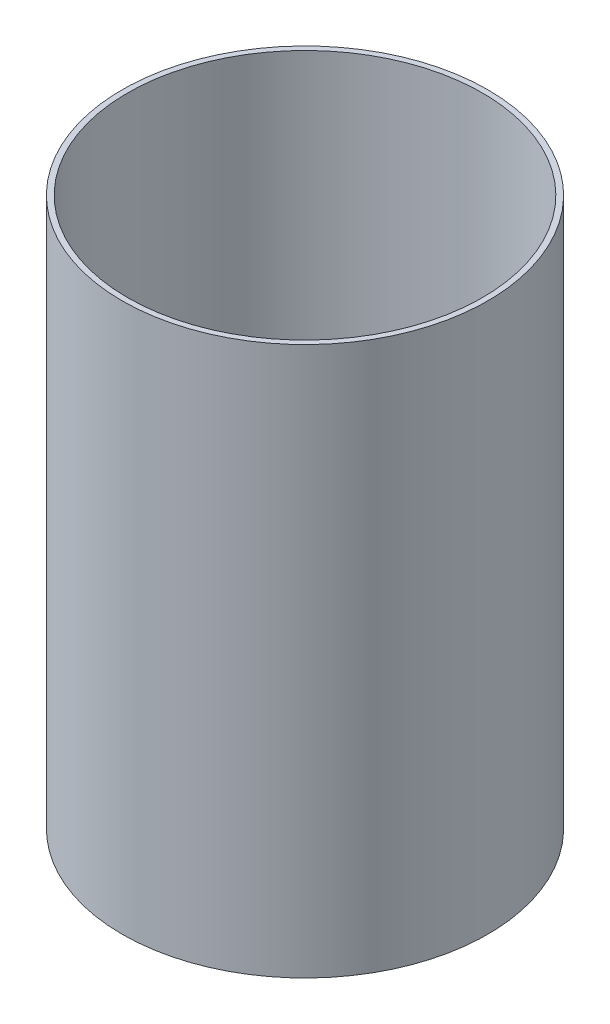
ISO-10303-21;
HEADER;
FILE_DESCRIPTION(('STEP AP214'),'2;1');
FILE_NAME('part.step','',(''),(''),'','','');
FILE_SCHEMA(('AUTOMOTIVE_DESIGN { 1 0 10303 214 1 1 1 1 }'));
ENDSEC;
DATA;
#1=APPLICATION_CONTEXT('core data for automotive mechanical design processes');
#2=APPLICATION_PROTOCOL_DEFINITION('international standard','automotive_design',2000,#1);
#3=PRODUCT_CONTEXT('',#1,'mechanical');
#4=PRODUCT('Part','Part','',(#3));
#5=PRODUCT_RELATED_PRODUCT_CATEGORY('part','',(#4));
#6=PRODUCT_DEFINITION_FORMATION('','',#4);
#7=PRODUCT_DEFINITION_CONTEXT('part definition',#1,'design');
#8=PRODUCT_DEFINITION('design','',#6,#7);
#9=PRODUCT_DEFINITION_SHAPE('','',#8);
#10=(LENGTH_UNIT() NAMED_UNIT(*) SI_UNIT(.MILLI.,.METRE.));
#11=(NAMED_UNIT(*) PLANE_ANGLE_UNIT() SI_UNIT($,.RADIAN.));
#12=(NAMED_UNIT(*) SI_UNIT($,.STERADIAN.) SOLID_ANGLE_UNIT());
#13=UNCERTAINTY_MEASURE_WITH_UNIT(LENGTH_MEASURE(1.E-05),#10,'distance_accuracy_value','');
#14=(GEOMETRIC_REPRESENTATION_CONTEXT(3) GLOBAL_UNCERTAINTY_ASSIGNED_CONTEXT((#13)) GLOBAL_UNIT_ASSIGNED_CONTEXT((#10,
#11,#12)) REPRESENTATION_CONTEXT('',''));
#15=CARTESIAN_POINT('',(0.,0.,0.));
#16=DIRECTION('',(0.,0.,1.));
#17=DIRECTION('',(1.,0.,0.));
#18=AXIS2_PLACEMENT_3D('',#15,#16,#17);
#19=CARTESIAN_POINT('',(0.,300.,0.));
#20=DIRECTION('',(0.,1.,0.));
#21=DIRECTION('',(0.,0.,1.));
#22=AXIS2_PLACEMENT_3D('',#19,#20,#21);
#23=PLANE('',#22);
#24=CARTESIAN_POINT('',(0.,300.,0.));
#25=DIRECTION('',(0.,1.,0.));
#26=DIRECTION('',(0.,0.,1.));
#27=AXIS2_PLACEMENT_3D('',#24,#25,#26);
#28=CIRCLE('',#27,100.);
#29=CARTESIAN_POINT('',(0.,300.,100.));
#30=VERTEX_POINT('',#29);
#31=EDGE_CURVE('E10',#30,#30,#28,.T.);
#32=ORIENTED_EDGE('',*,*,#31,.T.);
#33=EDGE_LOOP('',(#32));
#34=FACE_BOUND('',#33,.T.);
#35=CARTESIAN_POINT('',(0.,300.,0.));
#36=DIRECTION('',(0.,1.,0.));
#37=DIRECTION('',(0.,0.,1.));
#38=AXIS2_PLACEMENT_3D('',#35,#36,#37);
#39=CIRCLE('',#38,97.);
#40=CARTESIAN_POINT('',(0.,300.,97.));
#41=VERTEX_POINT('',#40);
#42=EDGE_CURVE('E48',#41,#41,#39,.T.);
#43=ORIENTED_EDGE('',*,*,#42,.F.);
#44=EDGE_LOOP('',(#43));
#45=FACE_BOUND('',#44,.T.);
#46=ADVANCED_FACE('F37',(#34,#45),#23,.T.);
#47=CARTESIAN_POINT('',(0.,0.,0.));
#48=DIRECTION('',(0.,1.,0.));
#49=DIRECTION('',(0.,0.,1.));
#50=AXIS2_PLACEMENT_3D('',#47,#48,#49);
#51=PLANE('',#50);
#52=CARTESIAN_POINT('',(0.,0.,0.));
#53=DIRECTION('',(0.,1.,0.));
#54=DIRECTION('',(0.,0.,1.));
#55=AXIS2_PLACEMENT_3D('',#52,#53,#54);
#56=CIRCLE('',#55,100.);
#57=CARTESIAN_POINT('',(0.,0.,100.));
#58=VERTEX_POINT('',#57);
#59=EDGE_CURVE('E41',#58,#58,#56,.T.);
#60=ORIENTED_EDGE('',*,*,#59,.F.);
#61=EDGE_LOOP('',(#60));
#62=FACE_BOUND('',#61,.T.);
#63=CARTESIAN_POINT('',(0.,0.,0.));
#64=DIRECTION('',(0.,1.,0.));
#65=DIRECTION('',(0.,0.,1.));
#66=AXIS2_PLACEMENT_3D('',#63,#64,#65);
#67=CIRCLE('',#66,97.);
#68=CARTESIAN_POINT('',(0.,0.,97.));
#69=VERTEX_POINT('',#68);
#70=EDGE_CURVE('E50',#69,#69,#67,.T.);
#71=ORIENTED_EDGE('',*,*,#70,.T.);
#72=EDGE_LOOP('',(#71));
#73=FACE_BOUND('',#72,.T.);
#74=ADVANCED_FACE('F60',(#62,#73),#51,.F.);
#75=CARTESIAN_POINT('',(0.,300.,0.));
#76=DIRECTION('',(0.,-1.,0.));
#77=DIRECTION('',(0.,0.,-1.));
#78=AXIS2_PLACEMENT_3D('',#75,#76,#77);
#79=CYLINDRICAL_SURFACE('',#78,100.);
#80=ORIENTED_EDGE('',*,*,#31,.F.);
#81=EDGE_LOOP('',(#80));
#82=FACE_BOUND('',#81,.T.);
#83=ORIENTED_EDGE('',*,*,#59,.T.);
#84=EDGE_LOOP('',(#83));
#85=FACE_BOUND('',#84,.T.);
#86=ADVANCED_FACE('F39',(#82,#85),#79,.T.);
#87=CARTESIAN_POINT('',(0.,300.,0.));
#88=DIRECTION('',(0.,-1.,0.));
#89=DIRECTION('',(0.,0.,-1.));
#90=AXIS2_PLACEMENT_3D('',#87,#88,#89);
#91=CYLINDRICAL_SURFACE('',#90,97.);
#92=ORIENTED_EDGE('',*,*,#42,.T.);
#93=EDGE_LOOP('',(#92));
#94=FACE_BOUND('',#93,.T.);
#95=ORIENTED_EDGE('',*,*,#70,.F.);
#96=EDGE_LOOP('',(#95));
#97=FACE_BOUND('',#96,.T.);
#98=ADVANCED_FACE('F56',(#94,#97),#91,.F.);
#99=CLOSED_SHELL('',(#46,#74,#86,#98));
#100=MANIFOLD_SOLID_BREP('B2',#99);
#101=ADVANCED_BREP_SHAPE_REPRESENTATION('',(#18,#100),#14);
#102=SHAPE_DEFINITION_REPRESENTATION(#9,#101);
ENDSEC;
END-ISO-10303-21;
